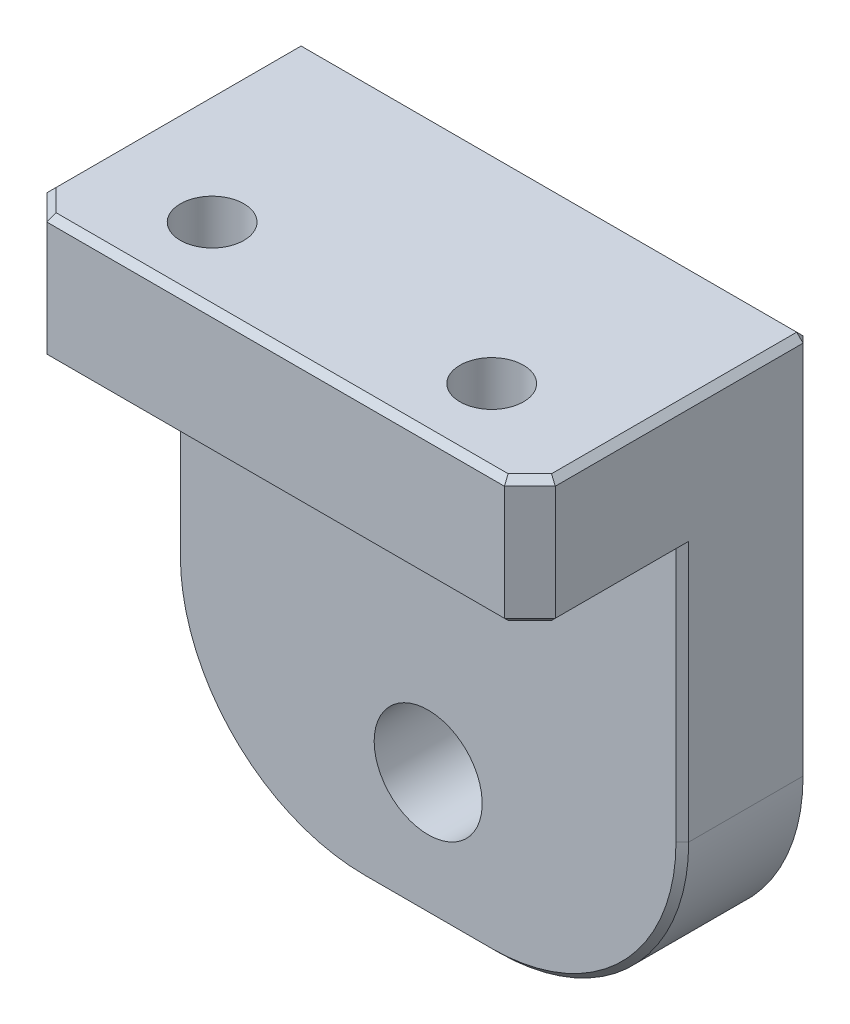
ISO-10303-21;
HEADER;
FILE_DESCRIPTION(('STEP AP214'),'2;1');
FILE_NAME('part.step','',(''),(''),'','','');
FILE_SCHEMA(('AUTOMOTIVE_DESIGN { 1 0 10303 214 1 1 1 1 }'));
ENDSEC;
DATA;
#1=APPLICATION_CONTEXT('core data for automotive mechanical design processes');
#2=APPLICATION_PROTOCOL_DEFINITION('international standard','automotive_design',2000,#1);
#3=PRODUCT_CONTEXT('',#1,'mechanical');
#4=PRODUCT('Part','Part','',(#3));
#5=PRODUCT_RELATED_PRODUCT_CATEGORY('part','',(#4));
#6=PRODUCT_DEFINITION_FORMATION('','',#4);
#7=PRODUCT_DEFINITION_CONTEXT('part definition',#1,'design');
#8=PRODUCT_DEFINITION('design','',#6,#7);
#9=PRODUCT_DEFINITION_SHAPE('','',#8);
#10=(LENGTH_UNIT() NAMED_UNIT(*) SI_UNIT(.MILLI.,.METRE.));
#11=(NAMED_UNIT(*) PLANE_ANGLE_UNIT() SI_UNIT($,.RADIAN.));
#12=(NAMED_UNIT(*) SI_UNIT($,.STERADIAN.) SOLID_ANGLE_UNIT());
#13=UNCERTAINTY_MEASURE_WITH_UNIT(LENGTH_MEASURE(1.E-05),#10,'distance_accuracy_value','');
#14=(GEOMETRIC_REPRESENTATION_CONTEXT(3) GLOBAL_UNCERTAINTY_ASSIGNED_CONTEXT((#13)) GLOBAL_UNIT_ASSIGNED_CONTEXT((#10,
#11,#12)) REPRESENTATION_CONTEXT('',''));
#15=CARTESIAN_POINT('',(0.,0.,0.));
#16=DIRECTION('',(0.,0.,1.));
#17=DIRECTION('',(1.,0.,0.));
#18=AXIS2_PLACEMENT_3D('',#15,#16,#17);
#19=CARTESIAN_POINT('',(0.,0.,5.));
#20=DIRECTION('',(0.,0.,-1.));
#21=DIRECTION('',(-1.,0.,0.));
#22=AXIS2_PLACEMENT_3D('',#19,#20,#21);
#23=PLANE('',#22);
#24=DIRECTION('',(1.,0.,0.));
#25=VECTOR('',#24,1.);
#26=CARTESIAN_POINT('',(-20.,12.5,5.));
#27=LINE('',#26,#25);
#28=CARTESIAN_POINT('',(-19.5,12.5,5.));
#29=VERTEX_POINT('',#28);
#30=CARTESIAN_POINT('',(19.5,12.5,5.));
#31=VERTEX_POINT('',#30);
#32=EDGE_CURVE('E207',#29,#31,#27,.T.);
#33=ORIENTED_EDGE('',*,*,#32,.F.);
#34=DIRECTION('',(0.,-1.,0.));
#35=VECTOR('',#34,1.);
#36=CARTESIAN_POINT('',(-19.5,0.,5.));
#37=LINE('',#36,#35);
#38=CARTESIAN_POINT('',(-19.5,-7.5,5.));
#39=VERTEX_POINT('',#38);
#40=EDGE_CURVE('E194',#29,#39,#37,.T.);
#41=ORIENTED_EDGE('',*,*,#40,.T.);
#42=CARTESIAN_POINT('',(-5.,-7.5,5.));
#43=DIRECTION('',(0.,0.,-1.));
#44=DIRECTION('',(-1.,0.,0.));
#45=AXIS2_PLACEMENT_3D('',#42,#43,#44);
#46=CIRCLE('',#45,14.5);
#47=CARTESIAN_POINT('',(-5.,-22.,5.));
#48=VERTEX_POINT('',#47);
#49=EDGE_CURVE('E202',#39,#48,#46,.F.);
#50=ORIENTED_EDGE('',*,*,#49,.T.);
#51=DIRECTION('',(1.,0.,0.));
#52=VECTOR('',#51,1.);
#53=CARTESIAN_POINT('',(0.,-22.,5.));
#54=LINE('',#53,#52);
#55=CARTESIAN_POINT('',(5.,-22.,5.));
#56=VERTEX_POINT('',#55);
#57=EDGE_CURVE('E285',#48,#56,#54,.T.);
#58=ORIENTED_EDGE('',*,*,#57,.T.);
#59=CARTESIAN_POINT('',(5.,-7.5,5.));
#60=DIRECTION('',(0.,0.,-1.));
#61=DIRECTION('',(-1.,0.,0.));
#62=AXIS2_PLACEMENT_3D('',#59,#60,#61);
#63=CIRCLE('',#62,14.5);
#64=CARTESIAN_POINT('',(19.5,-7.5,5.));
#65=VERTEX_POINT('',#64);
#66=EDGE_CURVE('E282',#56,#65,#63,.F.);
#67=ORIENTED_EDGE('',*,*,#66,.T.);
#68=DIRECTION('',(0.,1.,0.));
#69=VECTOR('',#68,1.);
#70=CARTESIAN_POINT('',(19.5,0.,5.));
#71=LINE('',#70,#69);
#72=EDGE_CURVE('E216',#65,#31,#71,.T.);
#73=ORIENTED_EDGE('',*,*,#72,.T.);
#74=EDGE_LOOP('',(#33,#41,#50,#58,#67,#73));
#75=FACE_BOUND('',#74,.T.);
#76=CARTESIAN_POINT('',(0.,-12.5,5.));
#77=DIRECTION('',(0.,0.,-1.));
#78=DIRECTION('',(-1.,0.,0.));
#79=AXIS2_PLACEMENT_3D('',#76,#77,#78);
#80=CIRCLE('',#79,4.24999999999999);
#81=CARTESIAN_POINT('',(-4.25,-12.5,5.));
#82=VERTEX_POINT('',#81);
#83=EDGE_CURVE('E218',#82,#82,#80,.T.);
#84=ORIENTED_EDGE('',*,*,#83,.T.);
#85=EDGE_LOOP('',(#84));
#86=FACE_BOUND('',#85,.T.);
#87=ADVANCED_FACE('F36',(#75,#86),#23,.F.);
#88=CARTESIAN_POINT('',(20.,-22.5,5.));
#89=DIRECTION('',(-1.,0.,0.));
#90=DIRECTION('',(0.,0.,1.));
#91=AXIS2_PLACEMENT_3D('',#88,#89,#90);
#92=PLANE('',#91);
#93=DIRECTION('',(0.,-1.,0.));
#94=VECTOR('',#93,1.);
#95=CARTESIAN_POINT('',(20.,12.5,15.));
#96=LINE('',#95,#94);
#97=CARTESIAN_POINT('',(20.,22.,15.));
#98=VERTEX_POINT('',#97);
#99=CARTESIAN_POINT('',(20.,13.,15.));
#100=VERTEX_POINT('',#99);
#101=EDGE_CURVE('E245',#98,#100,#96,.T.);
#102=ORIENTED_EDGE('',*,*,#101,.T.);
#103=DIRECTION('',(0.,0.,-1.));
#104=VECTOR('',#103,1.);
#105=CARTESIAN_POINT('',(20.,13.,5.));
#106=LINE('',#105,#104);
#107=CARTESIAN_POINT('',(20.,13.,4.5));
#108=VERTEX_POINT('',#107);
#109=EDGE_CURVE('E280',#100,#108,#106,.T.);
#110=ORIENTED_EDGE('',*,*,#109,.T.);
#111=DIRECTION('',(0.,-1.,0.));
#112=VECTOR('',#111,1.);
#113=CARTESIAN_POINT('',(20.,-22.5,4.5));
#114=LINE('',#113,#112);
#115=CARTESIAN_POINT('',(20.,-7.5,4.5));
#116=VERTEX_POINT('',#115);
#117=EDGE_CURVE('E278',#108,#116,#114,.T.);
#118=ORIENTED_EDGE('',*,*,#117,.T.);
#119=DIRECTION('',(0.,0.,-1.));
#120=VECTOR('',#119,1.);
#121=CARTESIAN_POINT('',(20.,-7.5,5.));
#122=LINE('',#121,#120);
#123=CARTESIAN_POINT('',(20.,-7.5,-4.5));
#124=VERTEX_POINT('',#123);
#125=EDGE_CURVE('E233',#116,#124,#122,.T.);
#126=ORIENTED_EDGE('',*,*,#125,.T.);
#127=DIRECTION('',(0.,1.,0.));
#128=VECTOR('',#127,1.);
#129=CARTESIAN_POINT('',(20.,22.5,-4.5));
#130=LINE('',#129,#128);
#131=CARTESIAN_POINT('',(20.,22.,-4.5));
#132=VERTEX_POINT('',#131);
#133=EDGE_CURVE('E274',#124,#132,#130,.T.);
#134=ORIENTED_EDGE('',*,*,#133,.T.);
#135=DIRECTION('',(0.,0.,1.));
#136=VECTOR('',#135,1.);
#137=CARTESIAN_POINT('',(20.,22.,5.));
#138=LINE('',#137,#136);
#139=EDGE_CURVE('E276',#132,#98,#138,.T.);
#140=ORIENTED_EDGE('',*,*,#139,.T.);
#141=EDGE_LOOP('',(#102,#110,#118,#126,#134,#140));
#142=FACE_BOUND('',#141,.T.);
#143=ADVANCED_FACE('F454',(#142),#92,.F.);
#144=CARTESIAN_POINT('',(-20.,22.5,5.));
#145=DIRECTION('',(0.,-1.,0.));
#146=DIRECTION('',(0.,0.,-1.));
#147=AXIS2_PLACEMENT_3D('',#144,#145,#146);
#148=PLANE('',#147);
#149=DIRECTION('',(0.,0.,1.));
#150=VECTOR('',#149,1.);
#151=CARTESIAN_POINT('',(-19.5,22.5,5.));
#152=LINE('',#151,#150);
#153=CARTESIAN_POINT('',(-19.5,22.5,-4.5));
#154=VERTEX_POINT('',#153);
#155=CARTESIAN_POINT('',(-19.5,22.5,14.7928932188134));
#156=VERTEX_POINT('',#155);
#157=EDGE_CURVE('E316',#154,#156,#152,.T.);
#158=ORIENTED_EDGE('',*,*,#157,.T.);
#159=DIRECTION('',(0.707106781186546,0.,0.707106781186549));
#160=VECTOR('',#159,1.);
#161=CARTESIAN_POINT('',(-17.6464466094067,22.5,16.6464466094067));
#162=LINE('',#161,#160);
#163=CARTESIAN_POINT('',(-17.7928932188134,22.5,16.5));
#164=VERTEX_POINT('',#163);
#165=EDGE_CURVE('E11',#156,#164,#162,.T.);
#166=ORIENTED_EDGE('',*,*,#165,.T.);
#167=DIRECTION('',(1.,0.,0.));
#168=VECTOR('',#167,1.);
#169=CARTESIAN_POINT('',(18.,22.5,16.5));
#170=LINE('',#169,#168);
#171=CARTESIAN_POINT('',(17.7928932188134,22.5,16.5));
#172=VERTEX_POINT('',#171);
#173=EDGE_CURVE('E45',#164,#172,#170,.T.);
#174=ORIENTED_EDGE('',*,*,#173,.T.);
#175=DIRECTION('',(0.707106781186546,0.,-0.707106781186549));
#176=VECTOR('',#175,1.);
#177=CARTESIAN_POINT('',(19.6464466094067,22.5,14.6464466094067));
#178=LINE('',#177,#176);
#179=CARTESIAN_POINT('',(19.5,22.5,14.7928932188134));
#180=VERTEX_POINT('',#179);
#181=EDGE_CURVE('E318',#172,#180,#178,.T.);
#182=ORIENTED_EDGE('',*,*,#181,.T.);
#183=DIRECTION('',(0.,0.,-1.));
#184=VECTOR('',#183,1.);
#185=CARTESIAN_POINT('',(19.5,22.5,5.));
#186=LINE('',#185,#184);
#187=CARTESIAN_POINT('',(19.5,22.5,-4.5));
#188=VERTEX_POINT('',#187);
#189=EDGE_CURVE('E314',#180,#188,#186,.T.);
#190=ORIENTED_EDGE('',*,*,#189,.T.);
#191=DIRECTION('',(-1.,0.,0.));
#192=VECTOR('',#191,1.);
#193=CARTESIAN_POINT('',(-20.,22.5,-4.5));
#194=LINE('',#193,#192);
#195=EDGE_CURVE('E312',#188,#154,#194,.T.);
#196=ORIENTED_EDGE('',*,*,#195,.T.);
#197=EDGE_LOOP('',(#158,#166,#174,#182,#190,#196));
#198=FACE_BOUND('',#197,.T.);
#199=CARTESIAN_POINT('',(11.,22.5,11.));
#200=DIRECTION('',(0.,-1.,0.));
#201=DIRECTION('',(0.,0.,-1.));
#202=AXIS2_PLACEMENT_3D('',#199,#200,#201);
#203=CIRCLE('',#202,2.49999999999999);
#204=CARTESIAN_POINT('',(11.,22.5,8.50000000000001));
#205=VERTEX_POINT('',#204);
#206=EDGE_CURVE('E486',#205,#205,#203,.T.);
#207=ORIENTED_EDGE('',*,*,#206,.T.);
#208=EDGE_LOOP('',(#207));
#209=FACE_BOUND('',#208,.T.);
#210=CARTESIAN_POINT('',(-11.,22.5,11.));
#211=DIRECTION('',(0.,-1.,0.));
#212=DIRECTION('',(0.,0.,-1.));
#213=AXIS2_PLACEMENT_3D('',#210,#211,#212);
#214=CIRCLE('',#213,2.49999999999999);
#215=CARTESIAN_POINT('',(-11.,22.5,8.50000000000001));
#216=VERTEX_POINT('',#215);
#217=EDGE_CURVE('E489',#216,#216,#214,.T.);
#218=ORIENTED_EDGE('',*,*,#217,.T.);
#219=EDGE_LOOP('',(#218));
#220=FACE_BOUND('',#219,.T.);
#221=ADVANCED_FACE('F479',(#198,#209,#220),#148,.F.);
#222=CARTESIAN_POINT('',(-20.,-22.5,5.));
#223=DIRECTION('',(1.,0.,0.));
#224=DIRECTION('',(0.,0.,-1.));
#225=AXIS2_PLACEMENT_3D('',#222,#223,#224);
#226=PLANE('',#225);
#227=DIRECTION('',(0.,1.,0.));
#228=VECTOR('',#227,1.);
#229=CARTESIAN_POINT('',(-20.,-22.5,4.5));
#230=LINE('',#229,#228);
#231=CARTESIAN_POINT('',(-20.,-7.5,4.5));
#232=VERTEX_POINT('',#231);
#233=CARTESIAN_POINT('',(-20.,13.,4.5));
#234=VERTEX_POINT('',#233);
#235=EDGE_CURVE('E259',#232,#234,#230,.T.);
#236=ORIENTED_EDGE('',*,*,#235,.T.);
#237=DIRECTION('',(0.,0.,1.));
#238=VECTOR('',#237,1.);
#239=CARTESIAN_POINT('',(-20.,13.,5.));
#240=LINE('',#239,#238);
#241=CARTESIAN_POINT('',(-20.,13.,15.));
#242=VERTEX_POINT('',#241);
#243=EDGE_CURVE('E188',#234,#242,#240,.T.);
#244=ORIENTED_EDGE('',*,*,#243,.T.);
#245=DIRECTION('',(0.,1.,0.));
#246=VECTOR('',#245,1.);
#247=CARTESIAN_POINT('',(-20.,22.5,15.));
#248=LINE('',#247,#246);
#249=CARTESIAN_POINT('',(-20.,22.,15.));
#250=VERTEX_POINT('',#249);
#251=EDGE_CURVE('E242',#242,#250,#248,.T.);
#252=ORIENTED_EDGE('',*,*,#251,.T.);
#253=DIRECTION('',(0.,0.,-1.));
#254=VECTOR('',#253,1.);
#255=CARTESIAN_POINT('',(-20.,22.,5.));
#256=LINE('',#255,#254);
#257=CARTESIAN_POINT('',(-20.,22.,-4.5));
#258=VERTEX_POINT('',#257);
#259=EDGE_CURVE('E212',#250,#258,#256,.T.);
#260=ORIENTED_EDGE('',*,*,#259,.T.);
#261=DIRECTION('',(0.,-1.,0.));
#262=VECTOR('',#261,1.);
#263=CARTESIAN_POINT('',(-20.,-7.5,-4.5));
#264=LINE('',#263,#262);
#265=CARTESIAN_POINT('',(-20.,-7.5,-4.5));
#266=VERTEX_POINT('',#265);
#267=EDGE_CURVE('E256',#258,#266,#264,.T.);
#268=ORIENTED_EDGE('',*,*,#267,.T.);
#269=DIRECTION('',(0.,0.,-1.));
#270=VECTOR('',#269,1.);
#271=CARTESIAN_POINT('',(-20.,-7.5,5.));
#272=LINE('',#271,#270);
#273=EDGE_CURVE('E230',#266,#232,#272,.F.);
#274=ORIENTED_EDGE('',*,*,#273,.T.);
#275=EDGE_LOOP('',(#236,#244,#252,#260,#268,#274));
#276=FACE_BOUND('',#275,.T.);
#277=ADVANCED_FACE('F411',(#276),#226,.F.);
#278=CARTESIAN_POINT('',(-20.,-22.5,5.));
#279=DIRECTION('',(0.,1.,0.));
#280=DIRECTION('',(0.,0.,1.));
#281=AXIS2_PLACEMENT_3D('',#278,#279,#280);
#282=PLANE('',#281);
#283=DIRECTION('',(0.,0.,-1.));
#284=VECTOR('',#283,1.);
#285=CARTESIAN_POINT('',(5.,-22.5,5.));
#286=LINE('',#285,#284);
#287=CARTESIAN_POINT('',(5.,-22.5,-4.5));
#288=VERTEX_POINT('',#287);
#289=CARTESIAN_POINT('',(5.,-22.5,4.5));
#290=VERTEX_POINT('',#289);
#291=EDGE_CURVE('E217',#288,#290,#286,.F.);
#292=ORIENTED_EDGE('',*,*,#291,.T.);
#293=DIRECTION('',(-1.,0.,0.));
#294=VECTOR('',#293,1.);
#295=CARTESIAN_POINT('',(-20.,-22.5,4.5));
#296=LINE('',#295,#294);
#297=CARTESIAN_POINT('',(-5.,-22.5,4.5));
#298=VERTEX_POINT('',#297);
#299=EDGE_CURVE('E293',#290,#298,#296,.T.);
#300=ORIENTED_EDGE('',*,*,#299,.T.);
#301=DIRECTION('',(0.,0.,-1.));
#302=VECTOR('',#301,1.);
#303=CARTESIAN_POINT('',(-5.,-22.5,5.));
#304=LINE('',#303,#302);
#305=CARTESIAN_POINT('',(-5.,-22.5,-4.5));
#306=VERTEX_POINT('',#305);
#307=EDGE_CURVE('E221',#298,#306,#304,.T.);
#308=ORIENTED_EDGE('',*,*,#307,.T.);
#309=DIRECTION('',(1.,0.,0.));
#310=VECTOR('',#309,1.);
#311=CARTESIAN_POINT('',(5.,-22.5,-4.5));
#312=LINE('',#311,#310);
#313=EDGE_CURVE('E291',#306,#288,#312,.T.);
#314=ORIENTED_EDGE('',*,*,#313,.T.);
#315=EDGE_LOOP('',(#292,#300,#308,#314));
#316=FACE_BOUND('',#315,.T.);
#317=ADVANCED_FACE('F530',(#316),#282,.F.);
#318=CARTESIAN_POINT('',(0.,0.,-5.));
#319=DIRECTION('',(0.,0.,-1.));
#320=DIRECTION('',(-1.,0.,0.));
#321=AXIS2_PLACEMENT_3D('',#318,#319,#320);
#322=PLANE('',#321);
#323=CARTESIAN_POINT('',(-5.,-7.5,-5.));
#324=DIRECTION('',(0.,0.,-1.));
#325=DIRECTION('',(-1.,0.,0.));
#326=AXIS2_PLACEMENT_3D('',#323,#324,#325);
#327=CIRCLE('',#326,14.5);
#328=CARTESIAN_POINT('',(-5.,-22.,-5.));
#329=VERTEX_POINT('',#328);
#330=CARTESIAN_POINT('',(-19.5,-7.5,-5.));
#331=VERTEX_POINT('',#330);
#332=EDGE_CURVE('E307',#329,#331,#327,.T.);
#333=ORIENTED_EDGE('',*,*,#332,.T.);
#334=DIRECTION('',(0.,1.,0.));
#335=VECTOR('',#334,1.);
#336=CARTESIAN_POINT('',(-19.5,22.5,-5.));
#337=LINE('',#336,#335);
#338=CARTESIAN_POINT('',(-19.5,22.,-5.));
#339=VERTEX_POINT('',#338);
#340=EDGE_CURVE('E309',#331,#339,#337,.T.);
#341=ORIENTED_EDGE('',*,*,#340,.T.);
#342=DIRECTION('',(1.,0.,0.));
#343=VECTOR('',#342,1.);
#344=CARTESIAN_POINT('',(20.,22.,-5.));
#345=LINE('',#344,#343);
#346=CARTESIAN_POINT('',(19.5,22.,-5.));
#347=VERTEX_POINT('',#346);
#348=EDGE_CURVE('E299',#339,#347,#345,.T.);
#349=ORIENTED_EDGE('',*,*,#348,.T.);
#350=DIRECTION('',(0.,-1.,0.));
#351=VECTOR('',#350,1.);
#352=CARTESIAN_POINT('',(19.5,-7.5,-5.));
#353=LINE('',#352,#351);
#354=CARTESIAN_POINT('',(19.5,-7.5,-5.));
#355=VERTEX_POINT('',#354);
#356=EDGE_CURVE('E301',#347,#355,#353,.T.);
#357=ORIENTED_EDGE('',*,*,#356,.T.);
#358=CARTESIAN_POINT('',(5.,-7.5,-5.));
#359=DIRECTION('',(0.,0.,-1.));
#360=DIRECTION('',(-1.,0.,0.));
#361=AXIS2_PLACEMENT_3D('',#358,#359,#360);
#362=CIRCLE('',#361,14.5);
#363=CARTESIAN_POINT('',(5.,-22.,-5.));
#364=VERTEX_POINT('',#363);
#365=EDGE_CURVE('E303',#355,#364,#362,.T.);
#366=ORIENTED_EDGE('',*,*,#365,.T.);
#367=DIRECTION('',(-1.,0.,0.));
#368=VECTOR('',#367,1.);
#369=CARTESIAN_POINT('',(-5.,-22.,-5.));
#370=LINE('',#369,#368);
#371=EDGE_CURVE('E305',#364,#329,#370,.T.);
#372=ORIENTED_EDGE('',*,*,#371,.T.);
#373=EDGE_LOOP('',(#333,#341,#349,#357,#366,#372));
#374=FACE_BOUND('',#373,.T.);
#375=CARTESIAN_POINT('',(0.,-12.5,-5.));
#376=DIRECTION('',(0.,0.,-1.));
#377=DIRECTION('',(-1.,0.,0.));
#378=AXIS2_PLACEMENT_3D('',#375,#376,#377);
#379=CIRCLE('',#378,4.25);
#380=CARTESIAN_POINT('',(-4.25,-12.5,-5.));
#381=VERTEX_POINT('',#380);
#382=EDGE_CURVE('E224',#381,#381,#379,.T.);
#383=ORIENTED_EDGE('',*,*,#382,.F.);
#384=EDGE_LOOP('',(#383));
#385=FACE_BOUND('',#384,.T.);
#386=ADVANCED_FACE('F468',(#374,#385),#322,.T.);
#387=CARTESIAN_POINT('',(-20.,12.5,17.));
#388=DIRECTION('',(0.,1.,0.));
#389=DIRECTION('',(-1.,0.,0.));
#390=AXIS2_PLACEMENT_3D('',#387,#388,#389);
#391=PLANE('',#390);
#392=CARTESIAN_POINT('',(11.,12.5,11.));
#393=DIRECTION('',(0.,-1.,0.));
#394=DIRECTION('',(0.,0.,-1.));
#395=AXIS2_PLACEMENT_3D('',#392,#393,#394);
#396=CIRCLE('',#395,2.5);
#397=CARTESIAN_POINT('',(11.,12.5,8.50000000000001));
#398=VERTEX_POINT('',#397);
#399=EDGE_CURVE('E344',#398,#398,#396,.T.);
#400=ORIENTED_EDGE('',*,*,#399,.F.);
#401=EDGE_LOOP('',(#400));
#402=FACE_BOUND('',#401,.T.);
#403=CARTESIAN_POINT('',(-11.,12.5,11.));
#404=DIRECTION('',(0.,-1.,0.));
#405=DIRECTION('',(0.,0.,-1.));
#406=AXIS2_PLACEMENT_3D('',#403,#404,#405);
#407=CIRCLE('',#406,2.5);
#408=CARTESIAN_POINT('',(-11.,12.5,8.50000000000001));
#409=VERTEX_POINT('',#408);
#410=EDGE_CURVE('E491',#409,#409,#407,.T.);
#411=ORIENTED_EDGE('',*,*,#410,.F.);
#412=EDGE_LOOP('',(#411));
#413=FACE_BOUND('',#412,.T.);
#414=DIRECTION('',(-0.707106781186546,0.,-0.707106781186549));
#415=VECTOR('',#414,1.);
#416=CARTESIAN_POINT('',(-19.6464466094067,12.5,14.6464466094067));
#417=LINE('',#416,#415);
#418=CARTESIAN_POINT('',(-17.7928932188134,12.5,16.5));
#419=VERTEX_POINT('',#418);
#420=CARTESIAN_POINT('',(-19.5,12.5,14.7928932188134));
#421=VERTEX_POINT('',#420);
#422=EDGE_CURVE('E210',#419,#421,#417,.T.);
#423=ORIENTED_EDGE('',*,*,#422,.T.);
#424=DIRECTION('',(0.,0.,-1.));
#425=VECTOR('',#424,1.);
#426=CARTESIAN_POINT('',(-19.5,12.5,17.));
#427=LINE('',#426,#425);
#428=EDGE_CURVE('E186',#421,#29,#427,.T.);
#429=ORIENTED_EDGE('',*,*,#428,.T.);
#430=ORIENTED_EDGE('',*,*,#32,.T.);
#431=DIRECTION('',(0.,0.,1.));
#432=VECTOR('',#431,1.);
#433=CARTESIAN_POINT('',(19.5,12.5,17.));
#434=LINE('',#433,#432);
#435=CARTESIAN_POINT('',(19.5,12.5,14.7928932188134));
#436=VERTEX_POINT('',#435);
#437=EDGE_CURVE('E248',#31,#436,#434,.T.);
#438=ORIENTED_EDGE('',*,*,#437,.T.);
#439=DIRECTION('',(-0.707106781186546,0.,0.707106781186549));
#440=VECTOR('',#439,1.);
#441=CARTESIAN_POINT('',(17.6464466094067,12.5,16.6464466094067));
#442=LINE('',#441,#440);
#443=CARTESIAN_POINT('',(17.7928932188134,12.5,16.5));
#444=VERTEX_POINT('',#443);
#445=EDGE_CURVE('E250',#436,#444,#442,.T.);
#446=ORIENTED_EDGE('',*,*,#445,.T.);
#447=DIRECTION('',(-1.,0.,0.));
#448=VECTOR('',#447,1.);
#449=CARTESIAN_POINT('',(-18.,12.5,16.5));
#450=LINE('',#449,#448);
#451=EDGE_CURVE('E252',#444,#419,#450,.T.);
#452=ORIENTED_EDGE('',*,*,#451,.T.);
#453=EDGE_LOOP('',(#423,#429,#430,#438,#446,#452));
#454=FACE_BOUND('',#453,.T.);
#455=ADVANCED_FACE('F206',(#402,#413,#454),#391,.F.);
#456=CARTESIAN_POINT('',(0.,0.,17.));
#457=DIRECTION('',(0.,0.,1.));
#458=DIRECTION('',(1.,0.,0.));
#459=AXIS2_PLACEMENT_3D('',#456,#457,#458);
#460=PLANE('',#459);
#461=DIRECTION('',(0.,-1.,0.));
#462=VECTOR('',#461,1.);
#463=CARTESIAN_POINT('',(-18.,12.5,17.));
#464=LINE('',#463,#462);
#465=CARTESIAN_POINT('',(-18.,22.,17.));
#466=VERTEX_POINT('',#465);
#467=CARTESIAN_POINT('',(-18.,13.,17.));
#468=VERTEX_POINT('',#467);
#469=EDGE_CURVE('E239',#466,#468,#464,.T.);
#470=ORIENTED_EDGE('',*,*,#469,.T.);
#471=DIRECTION('',(1.,0.,0.));
#472=VECTOR('',#471,1.);
#473=CARTESIAN_POINT('',(18.,13.,17.));
#474=LINE('',#473,#472);
#475=CARTESIAN_POINT('',(18.,13.,17.));
#476=VERTEX_POINT('',#475);
#477=EDGE_CURVE('E268',#468,#476,#474,.T.);
#478=ORIENTED_EDGE('',*,*,#477,.T.);
#479=DIRECTION('',(0.,1.,0.));
#480=VECTOR('',#479,1.);
#481=CARTESIAN_POINT('',(18.,22.5,17.));
#482=LINE('',#481,#480);
#483=CARTESIAN_POINT('',(18.,22.,17.));
#484=VERTEX_POINT('',#483);
#485=EDGE_CURVE('E236',#476,#484,#482,.T.);
#486=ORIENTED_EDGE('',*,*,#485,.T.);
#487=DIRECTION('',(-1.,0.,0.));
#488=VECTOR('',#487,1.);
#489=CARTESIAN_POINT('',(-18.,22.,17.));
#490=LINE('',#489,#488);
#491=EDGE_CURVE('E266',#484,#466,#490,.T.);
#492=ORIENTED_EDGE('',*,*,#491,.T.);
#493=EDGE_LOOP('',(#470,#478,#486,#492));
#494=FACE_BOUND('',#493,.T.);
#495=ADVANCED_FACE('F397',(#494),#460,.T.);
#496=CARTESIAN_POINT('',(0.,-12.5,-5.));
#497=DIRECTION('',(0.,0.,-1.));
#498=DIRECTION('',(-1.,0.,0.));
#499=AXIS2_PLACEMENT_3D('',#496,#497,#498);
#500=CYLINDRICAL_SURFACE('',#499,4.24999999999999);
#501=ORIENTED_EDGE('',*,*,#382,.T.);
#502=EDGE_LOOP('',(#501));
#503=FACE_BOUND('',#502,.T.);
#504=ORIENTED_EDGE('',*,*,#83,.F.);
#505=EDGE_LOOP('',(#504));
#506=FACE_BOUND('',#505,.T.);
#507=ADVANCED_FACE('F510',(#503,#506),#500,.F.);
#508=CARTESIAN_POINT('',(-11.,12.5,11.));
#509=DIRECTION('',(0.,-1.,0.));
#510=DIRECTION('',(0.,0.,-1.));
#511=AXIS2_PLACEMENT_3D('',#508,#509,#510);
#512=CYLINDRICAL_SURFACE('',#511,2.49999999999999);
#513=ORIENTED_EDGE('',*,*,#217,.F.);
#514=EDGE_LOOP('',(#513));
#515=FACE_BOUND('',#514,.T.);
#516=ORIENTED_EDGE('',*,*,#410,.T.);
#517=EDGE_LOOP('',(#516));
#518=FACE_BOUND('',#517,.T.);
#519=ADVANCED_FACE('F508',(#515,#518),#512,.F.);
#520=CARTESIAN_POINT('',(11.,12.5,11.));
#521=DIRECTION('',(0.,-1.,0.));
#522=DIRECTION('',(0.,0.,-1.));
#523=AXIS2_PLACEMENT_3D('',#520,#521,#522);
#524=CYLINDRICAL_SURFACE('',#523,2.49999999999999);
#525=ORIENTED_EDGE('',*,*,#206,.F.);
#526=EDGE_LOOP('',(#525));
#527=FACE_BOUND('',#526,.T.);
#528=ORIENTED_EDGE('',*,*,#399,.T.);
#529=EDGE_LOOP('',(#528));
#530=FACE_BOUND('',#529,.T.);
#531=ADVANCED_FACE('F501',(#527,#530),#524,.F.);
#532=CARTESIAN_POINT('',(-5.,-7.5,5.));
#533=DIRECTION('',(0.,0.,-1.));
#534=DIRECTION('',(-1.,0.,0.));
#535=AXIS2_PLACEMENT_3D('',#532,#533,#534);
#536=CYLINDRICAL_SURFACE('',#535,15.);
#537=ORIENTED_EDGE('',*,*,#307,.F.);
#538=CARTESIAN_POINT('',(-5.,-7.5,4.5));
#539=DIRECTION('',(0.,0.,-1.));
#540=DIRECTION('',(-1.,0.,0.));
#541=AXIS2_PLACEMENT_3D('',#538,#539,#540);
#542=CIRCLE('',#541,15.);
#543=EDGE_CURVE('E289',#298,#232,#542,.T.);
#544=ORIENTED_EDGE('',*,*,#543,.T.);
#545=ORIENTED_EDGE('',*,*,#273,.F.);
#546=CARTESIAN_POINT('',(-5.,-7.5,-4.5));
#547=DIRECTION('',(0.,0.,-1.));
#548=DIRECTION('',(-1.,0.,0.));
#549=AXIS2_PLACEMENT_3D('',#546,#547,#548);
#550=CIRCLE('',#549,15.);
#551=EDGE_CURVE('E201',#266,#306,#550,.F.);
#552=ORIENTED_EDGE('',*,*,#551,.T.);
#553=EDGE_LOOP('',(#537,#544,#545,#552));
#554=FACE_BOUND('',#553,.T.);
#555=ADVANCED_FACE('F426',(#554),#536,.T.);
#556=CARTESIAN_POINT('',(5.,-7.5,5.));
#557=DIRECTION('',(0.,0.,-1.));
#558=DIRECTION('',(-1.,0.,0.));
#559=AXIS2_PLACEMENT_3D('',#556,#557,#558);
#560=CYLINDRICAL_SURFACE('',#559,15.);
#561=ORIENTED_EDGE('',*,*,#125,.F.);
#562=CARTESIAN_POINT('',(5.,-7.5,4.5));
#563=DIRECTION('',(0.,0.,-1.));
#564=DIRECTION('',(-1.,0.,0.));
#565=AXIS2_PLACEMENT_3D('',#562,#563,#564);
#566=CIRCLE('',#565,15.);
#567=EDGE_CURVE('E297',#116,#290,#566,.T.);
#568=ORIENTED_EDGE('',*,*,#567,.T.);
#569=ORIENTED_EDGE('',*,*,#291,.F.);
#570=CARTESIAN_POINT('',(5.,-7.5,-4.5));
#571=DIRECTION('',(0.,0.,-1.));
#572=DIRECTION('',(-1.,0.,0.));
#573=AXIS2_PLACEMENT_3D('',#570,#571,#572);
#574=CIRCLE('',#573,15.);
#575=EDGE_CURVE('E295',#288,#124,#574,.F.);
#576=ORIENTED_EDGE('',*,*,#575,.T.);
#577=EDGE_LOOP('',(#561,#568,#569,#576));
#578=FACE_BOUND('',#577,.T.);
#579=ADVANCED_FACE('F538',(#578),#560,.T.);
#580=CARTESIAN_POINT('',(-18.,0.,17.));
#581=DIRECTION('',(-0.707106781186549,0.,0.707106781186546));
#582=DIRECTION('',(0.,1.,0.));
#583=AXIS2_PLACEMENT_3D('',#580,#581,#582);
#584=PLANE('',#583);
#585=ORIENTED_EDGE('',*,*,#251,.F.);
#586=DIRECTION('',(0.707106781186546,0.,0.707106781186549));
#587=VECTOR('',#586,1.);
#588=CARTESIAN_POINT('',(-18.,13.,17.));
#589=LINE('',#588,#587);
#590=EDGE_CURVE('E264',#242,#468,#589,.T.);
#591=ORIENTED_EDGE('',*,*,#590,.T.);
#592=ORIENTED_EDGE('',*,*,#469,.F.);
#593=DIRECTION('',(-0.707106781186546,0.,-0.707106781186549));
#594=VECTOR('',#593,1.);
#595=CARTESIAN_POINT('',(-20.,22.,15.));
#596=LINE('',#595,#594);
#597=EDGE_CURVE('E262',#466,#250,#596,.T.);
#598=ORIENTED_EDGE('',*,*,#597,.T.);
#599=EDGE_LOOP('',(#585,#591,#592,#598));
#600=FACE_BOUND('',#599,.T.);
#601=ADVANCED_FACE('F413',(#600),#584,.T.);
#602=CARTESIAN_POINT('',(18.,0.,17.));
#603=DIRECTION('',(0.707106781186549,0.,0.707106781186546));
#604=DIRECTION('',(0.,-1.,0.));
#605=AXIS2_PLACEMENT_3D('',#602,#603,#604);
#606=PLANE('',#605);
#607=ORIENTED_EDGE('',*,*,#485,.F.);
#608=DIRECTION('',(0.707106781186546,0.,-0.707106781186549));
#609=VECTOR('',#608,1.);
#610=CARTESIAN_POINT('',(20.,13.,15.));
#611=LINE('',#610,#609);
#612=EDGE_CURVE('E272',#476,#100,#611,.T.);
#613=ORIENTED_EDGE('',*,*,#612,.T.);
#614=ORIENTED_EDGE('',*,*,#101,.F.);
#615=DIRECTION('',(-0.707106781186546,0.,0.707106781186549));
#616=VECTOR('',#615,1.);
#617=CARTESIAN_POINT('',(18.,22.,17.));
#618=LINE('',#617,#616);
#619=EDGE_CURVE('E270',#98,#484,#618,.T.);
#620=ORIENTED_EDGE('',*,*,#619,.T.);
#621=EDGE_LOOP('',(#607,#613,#614,#620));
#622=FACE_BOUND('',#621,.T.);
#623=ADVANCED_FACE('F394',(#622),#606,.T.);
#624=CARTESIAN_POINT('',(19.5,0.,5.));
#625=DIRECTION('',(-0.707106781186547,0.,-0.707106781186547));
#626=DIRECTION('',(0.,1.,0.));
#627=AXIS2_PLACEMENT_3D('',#624,#625,#626);
#628=PLANE('',#627);
#629=DIRECTION('',(-0.707106781186547,0.,0.707106781186547));
#630=VECTOR('',#629,1.);
#631=CARTESIAN_POINT('',(20.,-7.5,4.5));
#632=LINE('',#631,#630);
#633=EDGE_CURVE('E338',#116,#65,#632,.T.);
#634=ORIENTED_EDGE('',*,*,#633,.F.);
#635=ORIENTED_EDGE('',*,*,#117,.F.);
#636=DIRECTION('',(-0.577350269189624,-0.57735026918963,0.577350269189624));
#637=VECTOR('',#636,1.);
#638=CARTESIAN_POINT('',(19.8333333333333,12.8333333333333,4.66666666666667));
#639=LINE('',#638,#637);
#640=EDGE_CURVE('E341',#31,#108,#639,.F.);
#641=ORIENTED_EDGE('',*,*,#640,.F.);
#642=ORIENTED_EDGE('',*,*,#72,.F.);
#643=EDGE_LOOP('',(#634,#635,#641,#642));
#644=FACE_BOUND('',#643,.T.);
#645=ADVANCED_FACE('F443',(#644),#628,.F.);
#646=CARTESIAN_POINT('',(20.,13.,5.));
#647=DIRECTION('',(-0.707106781186551,0.707106781186544,0.));
#648=DIRECTION('',(0.,0.,-1.));
#649=AXIS2_PLACEMENT_3D('',#646,#647,#648);
#650=PLANE('',#649);
#651=ORIENTED_EDGE('',*,*,#640,.T.);
#652=ORIENTED_EDGE('',*,*,#109,.F.);
#653=DIRECTION('',(0.67859834454584,0.678598344545847,0.281084637714838));
#654=VECTOR('',#653,1.);
#655=CARTESIAN_POINT('',(18.0925643016944,11.0925643016944,14.2099142644072));
#656=LINE('',#655,#654);
#657=EDGE_CURVE('E335',#436,#100,#656,.T.);
#658=ORIENTED_EDGE('',*,*,#657,.F.);
#659=ORIENTED_EDGE('',*,*,#437,.F.);
#660=EDGE_LOOP('',(#651,#652,#658,#659));
#661=FACE_BOUND('',#660,.T.);
#662=ADVANCED_FACE('F449',(#661),#650,.F.);
#663=CARTESIAN_POINT('',(5.,-7.5,5.));
#664=DIRECTION('',(0.,0.,-1.));
#665=DIRECTION('',(-1.,0.,0.));
#666=AXIS2_PLACEMENT_3D('',#663,#664,#665);
#667=CONICAL_SURFACE('',#666,14.5,0.785398163397448);
#668=ORIENTED_EDGE('',*,*,#633,.T.);
#669=ORIENTED_EDGE('',*,*,#66,.F.);
#670=DIRECTION('',(0.,0.707106781186547,0.707106781186547));
#671=VECTOR('',#670,1.);
#672=CARTESIAN_POINT('',(5.,-22.5,4.5));
#673=LINE('',#672,#671);
#674=EDGE_CURVE('E332',#290,#56,#673,.T.);
#675=ORIENTED_EDGE('',*,*,#674,.F.);
#676=ORIENTED_EDGE('',*,*,#567,.F.);
#677=EDGE_LOOP('',(#668,#669,#675,#676));
#678=FACE_BOUND('',#677,.T.);
#679=ADVANCED_FACE('F440',(#678),#667,.T.);
#680=CARTESIAN_POINT('',(-1.35355339059321,12.5,35.6464466094067));
#681=DIRECTION('',(0.499999999999998,-0.707106781186552,0.499999999999996));
#682=DIRECTION('',(0.707106781186546,0.,-0.707106781186549));
#683=AXIS2_PLACEMENT_3D('',#680,#681,#682);
#684=PLANE('',#683);
#685=ORIENTED_EDGE('',*,*,#657,.T.);
#686=ORIENTED_EDGE('',*,*,#612,.F.);
#687=DIRECTION('',(-0.281084637714833,-0.678598344545845,-0.678598344545844));
#688=VECTOR('',#687,1.);
#689=CARTESIAN_POINT('',(19.9322213593237,17.664795011186,21.664795011186));
#690=LINE('',#689,#688);
#691=EDGE_CURVE('E329',#444,#476,#690,.F.);
#692=ORIENTED_EDGE('',*,*,#691,.F.);
#693=ORIENTED_EDGE('',*,*,#445,.F.);
#694=EDGE_LOOP('',(#685,#686,#692,#693));
#695=FACE_BOUND('',#694,.T.);
#696=ADVANCED_FACE('F452',(#695),#684,.T.);
#697=CARTESIAN_POINT('',(0.,-22.,5.));
#698=DIRECTION('',(0.,0.707106781186547,-0.707106781186547));
#699=DIRECTION('',(1.,0.,0.));
#700=AXIS2_PLACEMENT_3D('',#697,#698,#699);
#701=PLANE('',#700);
#702=ORIENTED_EDGE('',*,*,#674,.T.);
#703=ORIENTED_EDGE('',*,*,#57,.F.);
#704=DIRECTION('',(0.,0.707106781186547,0.707106781186547));
#705=VECTOR('',#704,1.);
#706=CARTESIAN_POINT('',(-5.,-22.5,4.5));
#707=LINE('',#706,#705);
#708=EDGE_CURVE('E326',#298,#48,#707,.T.);
#709=ORIENTED_EDGE('',*,*,#708,.F.);
#710=ORIENTED_EDGE('',*,*,#299,.F.);
#711=EDGE_LOOP('',(#702,#703,#709,#710));
#712=FACE_BOUND('',#711,.T.);
#713=ADVANCED_FACE('F435',(#712),#701,.F.);
#714=CARTESIAN_POINT('',(0.,13.,17.));
#715=DIRECTION('',(0.,-0.707106781186547,0.707106781186548));
#716=DIRECTION('',(-1.,0.,0.));
#717=AXIS2_PLACEMENT_3D('',#714,#715,#716);
#718=PLANE('',#717);
#719=ORIENTED_EDGE('',*,*,#691,.T.);
#720=ORIENTED_EDGE('',*,*,#477,.F.);
#721=DIRECTION('',(0.281084637714823,-0.678598344545847,-0.678598344545846));
#722=VECTOR('',#721,1.);
#723=CARTESIAN_POINT('',(-16.5778456759331,9.56661574305015,13.5666157430501));
#724=LINE('',#723,#722);
#725=EDGE_CURVE('E323',#419,#468,#724,.F.);
#726=ORIENTED_EDGE('',*,*,#725,.F.);
#727=ORIENTED_EDGE('',*,*,#451,.F.);
#728=EDGE_LOOP('',(#719,#720,#726,#727));
#729=FACE_BOUND('',#728,.T.);
#730=ADVANCED_FACE('F402',(#729),#718,.T.);
#731=CARTESIAN_POINT('',(-5.,-7.5,5.));
#732=DIRECTION('',(0.,0.,-1.));
#733=DIRECTION('',(-1.,0.,0.));
#734=AXIS2_PLACEMENT_3D('',#731,#732,#733);
#735=CONICAL_SURFACE('',#734,14.5,0.785398163397448);
#736=ORIENTED_EDGE('',*,*,#708,.T.);
#737=ORIENTED_EDGE('',*,*,#49,.F.);
#738=DIRECTION('',(0.707106781186547,0.,0.707106781186547));
#739=VECTOR('',#738,1.);
#740=CARTESIAN_POINT('',(-20.,-7.5,4.5));
#741=LINE('',#740,#739);
#742=EDGE_CURVE('E197',#232,#39,#741,.T.);
#743=ORIENTED_EDGE('',*,*,#742,.F.);
#744=ORIENTED_EDGE('',*,*,#543,.F.);
#745=EDGE_LOOP('',(#736,#737,#743,#744));
#746=FACE_BOUND('',#745,.T.);
#747=ADVANCED_FACE('F431',(#746),#735,.T.);
#748=CARTESIAN_POINT('',(-18.6464466094067,12.5,15.6464466094067));
#749=DIRECTION('',(-0.500000000000001,-0.707106781186548,0.499999999999999));
#750=DIRECTION('',(0.707106781186546,0.,0.707106781186549));
#751=AXIS2_PLACEMENT_3D('',#748,#749,#750);
#752=PLANE('',#751);
#753=ORIENTED_EDGE('',*,*,#725,.T.);
#754=ORIENTED_EDGE('',*,*,#590,.F.);
#755=DIRECTION('',(-0.678598344545844,0.678598344545848,0.281084637714825));
#756=VECTOR('',#755,1.);
#757=CARTESIAN_POINT('',(-19.2697521433898,12.2697521433898,14.6975214338982));
#758=LINE('',#757,#756);
#759=EDGE_CURVE('E191',#421,#242,#758,.T.);
#760=ORIENTED_EDGE('',*,*,#759,.F.);
#761=ORIENTED_EDGE('',*,*,#422,.F.);
#762=EDGE_LOOP('',(#753,#754,#760,#761));
#763=FACE_BOUND('',#762,.T.);
#764=ADVANCED_FACE('F407',(#763),#752,.T.);
#765=CARTESIAN_POINT('',(-19.5,0.,5.));
#766=DIRECTION('',(0.707106781186547,0.,-0.707106781186547));
#767=DIRECTION('',(0.,-1.,0.));
#768=AXIS2_PLACEMENT_3D('',#765,#766,#767);
#769=PLANE('',#768);
#770=ORIENTED_EDGE('',*,*,#742,.T.);
#771=ORIENTED_EDGE('',*,*,#40,.F.);
#772=DIRECTION('',(-0.577350269189625,0.577350269189628,-0.577350269189625));
#773=VECTOR('',#772,1.);
#774=CARTESIAN_POINT('',(-15.5,8.49999999999999,8.99999999999998));
#775=LINE('',#774,#773);
#776=EDGE_CURVE('E182',#234,#29,#775,.F.);
#777=ORIENTED_EDGE('',*,*,#776,.F.);
#778=ORIENTED_EDGE('',*,*,#235,.F.);
#779=EDGE_LOOP('',(#770,#771,#777,#778));
#780=FACE_BOUND('',#779,.T.);
#781=ADVANCED_FACE('F195',(#780),#769,.F.);
#782=CARTESIAN_POINT('',(-19.5,12.5,17.));
#783=DIRECTION('',(0.70710678118655,0.707106781186545,0.));
#784=DIRECTION('',(0.,0.,-1.));
#785=AXIS2_PLACEMENT_3D('',#782,#783,#784);
#786=PLANE('',#785);
#787=ORIENTED_EDGE('',*,*,#759,.T.);
#788=ORIENTED_EDGE('',*,*,#243,.F.);
#789=ORIENTED_EDGE('',*,*,#776,.T.);
#790=ORIENTED_EDGE('',*,*,#428,.F.);
#791=EDGE_LOOP('',(#787,#788,#789,#790));
#792=FACE_BOUND('',#791,.T.);
#793=ADVANCED_FACE('F184',(#792),#786,.F.);
#794=CARTESIAN_POINT('',(4.64644660940678,22.5,29.6464466094067));
#795=DIRECTION('',(0.499999999999999,0.70710678118655,0.499999999999997));
#796=DIRECTION('',(-0.707106781186546,0.,0.707106781186549));
#797=AXIS2_PLACEMENT_3D('',#794,#795,#796);
#798=PLANE('',#797);
#799=DIRECTION('',(0.281084637714827,-0.678598344545846,0.678598344545846));
#800=VECTOR('',#799,1.);
#801=CARTESIAN_POINT('',(19.261811381696,18.9537178491528,20.0462821508472));
#802=LINE('',#801,#800);
#803=EDGE_CURVE('E376',#484,#172,#802,.F.);
#804=ORIENTED_EDGE('',*,*,#803,.F.);
#805=ORIENTED_EDGE('',*,*,#619,.F.);
#806=DIRECTION('',(-0.678598344545846,0.678598344545846,-0.281084637714826));
#807=VECTOR('',#806,1.);
#808=CARTESIAN_POINT('',(17.6320685884741,24.3679314115259,14.0191706945767));
#809=LINE('',#808,#807);
#810=EDGE_CURVE('E40',#180,#98,#809,.F.);
#811=ORIENTED_EDGE('',*,*,#810,.F.);
#812=ORIENTED_EDGE('',*,*,#181,.F.);
#813=EDGE_LOOP('',(#804,#805,#811,#812));
#814=FACE_BOUND('',#813,.T.);
#815=ADVANCED_FACE('F38',(#814),#798,.T.);
#816=CARTESIAN_POINT('',(19.5,22.5,5.));
#817=DIRECTION('',(-0.707106781186547,-0.707106781186547,0.));
#818=DIRECTION('',(0.,0.,-1.));
#819=AXIS2_PLACEMENT_3D('',#816,#817,#818);
#820=PLANE('',#819);
#821=ORIENTED_EDGE('',*,*,#810,.T.);
#822=ORIENTED_EDGE('',*,*,#139,.F.);
#823=DIRECTION('',(-0.707106781186547,0.707106781186547,0.));
#824=VECTOR('',#823,1.);
#825=CARTESIAN_POINT('',(19.5,22.5,-4.5));
#826=LINE('',#825,#824);
#827=EDGE_CURVE('E371',#188,#132,#826,.F.);
#828=ORIENTED_EDGE('',*,*,#827,.F.);
#829=ORIENTED_EDGE('',*,*,#189,.F.);
#830=EDGE_LOOP('',(#821,#822,#828,#829));
#831=FACE_BOUND('',#830,.T.);
#832=ADVANCED_FACE('F386',(#831),#820,.F.);
#833=CARTESIAN_POINT('',(0.,22.,17.));
#834=DIRECTION('',(0.,0.707106781186547,0.707106781186547));
#835=DIRECTION('',(1.,0.,0.));
#836=AXIS2_PLACEMENT_3D('',#833,#834,#835);
#837=PLANE('',#836);
#838=ORIENTED_EDGE('',*,*,#803,.T.);
#839=ORIENTED_EDGE('',*,*,#173,.F.);
#840=DIRECTION('',(-0.281084637714821,-0.678598344545847,0.678598344545847));
#841=VECTOR('',#840,1.);
#842=CARTESIAN_POINT('',(-16.5778456759331,25.4333842569498,13.5666157430502));
#843=LINE('',#842,#841);
#844=EDGE_CURVE('E53',#466,#164,#843,.F.);
#845=ORIENTED_EDGE('',*,*,#844,.F.);
#846=ORIENTED_EDGE('',*,*,#491,.F.);
#847=EDGE_LOOP('',(#838,#839,#845,#846));
#848=FACE_BOUND('',#847,.T.);
#849=ADVANCED_FACE('F593',(#848),#837,.T.);
#850=CARTESIAN_POINT('',(20.,-22.5,-4.5));
#851=DIRECTION('',(0.707106781186547,0.,-0.707106781186547));
#852=DIRECTION('',(0.,-1.,0.));
#853=AXIS2_PLACEMENT_3D('',#850,#851,#852);
#854=PLANE('',#853);
#855=DIRECTION('',(-0.707106781186547,0.,-0.707106781186547));
#856=VECTOR('',#855,1.);
#857=CARTESIAN_POINT('',(19.75,22.,-4.75));
#858=LINE('',#857,#856);
#859=EDGE_CURVE('E374',#132,#347,#858,.T.);
#860=ORIENTED_EDGE('',*,*,#859,.F.);
#861=ORIENTED_EDGE('',*,*,#133,.F.);
#862=DIRECTION('',(0.707106781186547,0.,0.707106781186547));
#863=VECTOR('',#862,1.);
#864=CARTESIAN_POINT('',(19.5,-7.5,-5.));
#865=LINE('',#864,#863);
#866=EDGE_CURVE('E367',#355,#124,#865,.T.);
#867=ORIENTED_EDGE('',*,*,#866,.F.);
#868=ORIENTED_EDGE('',*,*,#356,.F.);
#869=EDGE_LOOP('',(#860,#861,#867,#868));
#870=FACE_BOUND('',#869,.T.);
#871=ADVANCED_FACE('F459',(#870),#854,.T.);
#872=CARTESIAN_POINT('',(19.5,22.5,-4.5));
#873=DIRECTION('',(0.577350269189626,0.577350269189626,-0.577350269189626));
#874=DIRECTION('',(-0.707106781186547,0.,-0.707106781186547));
#875=AXIS2_PLACEMENT_3D('',#872,#873,#874);
#876=PLANE('',#875);
#877=ORIENTED_EDGE('',*,*,#827,.T.);
#878=ORIENTED_EDGE('',*,*,#859,.T.);
#879=DIRECTION('',(0.,0.707106781186547,0.707106781186547));
#880=VECTOR('',#879,1.);
#881=CARTESIAN_POINT('',(19.5,22.5,-4.5));
#882=LINE('',#881,#880);
#883=EDGE_CURVE('E364',#188,#347,#882,.F.);
#884=ORIENTED_EDGE('',*,*,#883,.F.);
#885=EDGE_LOOP('',(#877,#878,#884));
#886=FACE_BOUND('',#885,.T.);
#887=ADVANCED_FACE('F474',(#886),#876,.T.);
#888=CARTESIAN_POINT('',(-24.6464466094067,22.5,9.6464466094067));
#889=DIRECTION('',(-0.500000000000001,0.707106781186547,0.499999999999999));
#890=DIRECTION('',(-0.707106781186546,0.,-0.707106781186549));
#891=AXIS2_PLACEMENT_3D('',#888,#889,#890);
#892=PLANE('',#891);
#893=ORIENTED_EDGE('',*,*,#844,.T.);
#894=ORIENTED_EDGE('',*,*,#165,.F.);
#895=DIRECTION('',(-0.678598344545847,-0.678598344545847,0.28108463771482));
#896=VECTOR('',#895,1.);
#897=CARTESIAN_POINT('',(-18.0925643016945,23.9074356983055,14.2099142644073));
#898=LINE('',#897,#896);
#899=EDGE_CURVE('E361',#250,#156,#898,.F.);
#900=ORIENTED_EDGE('',*,*,#899,.F.);
#901=ORIENTED_EDGE('',*,*,#597,.F.);
#902=EDGE_LOOP('',(#893,#894,#900,#901));
#903=FACE_BOUND('',#902,.T.);
#904=ADVANCED_FACE('F414',(#903),#892,.T.);
#905=CARTESIAN_POINT('',(5.,-7.5,-5.));
#906=DIRECTION('',(0.,0.,1.));
#907=DIRECTION('',(1.,0.,0.));
#908=AXIS2_PLACEMENT_3D('',#905,#906,#907);
#909=CONICAL_SURFACE('',#908,14.5,0.785398163397448);
#910=ORIENTED_EDGE('',*,*,#866,.T.);
#911=ORIENTED_EDGE('',*,*,#575,.F.);
#912=DIRECTION('',(0.,-0.707106781186547,0.707106781186547));
#913=VECTOR('',#912,1.);
#914=CARTESIAN_POINT('',(5.,-22.,-5.));
#915=LINE('',#914,#913);
#916=EDGE_CURVE('E358',#364,#288,#915,.T.);
#917=ORIENTED_EDGE('',*,*,#916,.F.);
#918=ORIENTED_EDGE('',*,*,#365,.F.);
#919=EDGE_LOOP('',(#910,#911,#917,#918));
#920=FACE_BOUND('',#919,.T.);
#921=ADVANCED_FACE('F464',(#920),#909,.T.);
#922=CARTESIAN_POINT('',(-20.,22.5,-4.5));
#923=DIRECTION('',(0.,0.707106781186547,-0.707106781186547));
#924=DIRECTION('',(1.,0.,0.));
#925=AXIS2_PLACEMENT_3D('',#922,#923,#924);
#926=PLANE('',#925);
#927=ORIENTED_EDGE('',*,*,#883,.T.);
#928=ORIENTED_EDGE('',*,*,#348,.F.);
#929=DIRECTION('',(0.,-0.707106781186547,-0.707106781186547));
#930=VECTOR('',#929,1.);
#931=CARTESIAN_POINT('',(-19.5,22.,-5.));
#932=LINE('',#931,#930);
#933=EDGE_CURVE('E355',#154,#339,#932,.T.);
#934=ORIENTED_EDGE('',*,*,#933,.F.);
#935=ORIENTED_EDGE('',*,*,#195,.F.);
#936=EDGE_LOOP('',(#927,#928,#934,#935));
#937=FACE_BOUND('',#936,.T.);
#938=ADVANCED_FACE('F477',(#937),#926,.T.);
#939=CARTESIAN_POINT('',(-20.,22.,5.));
#940=DIRECTION('',(0.707106781186547,-0.707106781186547,0.));
#941=DIRECTION('',(0.,0.,-1.));
#942=AXIS2_PLACEMENT_3D('',#939,#940,#941);
#943=PLANE('',#942);
#944=ORIENTED_EDGE('',*,*,#899,.T.);
#945=ORIENTED_EDGE('',*,*,#157,.F.);
#946=DIRECTION('',(-0.707106781186547,-0.707106781186547,0.));
#947=VECTOR('',#946,1.);
#948=CARTESIAN_POINT('',(-19.75,22.25,-4.5));
#949=LINE('',#948,#947);
#950=EDGE_CURVE('E352',#258,#154,#949,.F.);
#951=ORIENTED_EDGE('',*,*,#950,.F.);
#952=ORIENTED_EDGE('',*,*,#259,.F.);
#953=EDGE_LOOP('',(#944,#945,#951,#952));
#954=FACE_BOUND('',#953,.T.);
#955=ADVANCED_FACE('F419',(#954),#943,.F.);
#956=CARTESIAN_POINT('',(-20.,-22.5,-4.5));
#957=DIRECTION('',(0.,-0.707106781186547,-0.707106781186547));
#958=DIRECTION('',(-1.,0.,0.));
#959=AXIS2_PLACEMENT_3D('',#956,#957,#958);
#960=PLANE('',#959);
#961=ORIENTED_EDGE('',*,*,#916,.T.);
#962=ORIENTED_EDGE('',*,*,#313,.F.);
#963=DIRECTION('',(0.,-0.707106781186547,0.707106781186547));
#964=VECTOR('',#963,1.);
#965=CARTESIAN_POINT('',(-5.,-22.,-5.));
#966=LINE('',#965,#964);
#967=EDGE_CURVE('E349',#329,#306,#966,.T.);
#968=ORIENTED_EDGE('',*,*,#967,.F.);
#969=ORIENTED_EDGE('',*,*,#371,.F.);
#970=EDGE_LOOP('',(#961,#962,#968,#969));
#971=FACE_BOUND('',#970,.T.);
#972=ADVANCED_FACE('F576',(#971),#960,.T.);
#973=CARTESIAN_POINT('',(-19.5,22.,-5.));
#974=DIRECTION('',(-0.577350269189626,0.577350269189626,-0.577350269189626));
#975=DIRECTION('',(-0.707106781186547,0.,0.707106781186547));
#976=AXIS2_PLACEMENT_3D('',#973,#974,#975);
#977=PLANE('',#976);
#978=ORIENTED_EDGE('',*,*,#950,.T.);
#979=ORIENTED_EDGE('',*,*,#933,.T.);
#980=DIRECTION('',(-0.707106781186547,0.,0.707106781186547));
#981=VECTOR('',#980,1.);
#982=CARTESIAN_POINT('',(-19.5,22.,-5.));
#983=LINE('',#982,#981);
#984=EDGE_CURVE('E347',#258,#339,#983,.F.);
#985=ORIENTED_EDGE('',*,*,#984,.F.);
#986=EDGE_LOOP('',(#978,#979,#985));
#987=FACE_BOUND('',#986,.T.);
#988=ADVANCED_FACE('F572',(#987),#977,.T.);
#989=CARTESIAN_POINT('',(-5.,-7.5,-5.));
#990=DIRECTION('',(0.,0.,1.));
#991=DIRECTION('',(1.,0.,0.));
#992=AXIS2_PLACEMENT_3D('',#989,#990,#991);
#993=CONICAL_SURFACE('',#992,14.5,0.785398163397448);
#994=ORIENTED_EDGE('',*,*,#967,.T.);
#995=ORIENTED_EDGE('',*,*,#551,.F.);
#996=DIRECTION('',(-0.707106781186547,0.,0.707106781186547));
#997=VECTOR('',#996,1.);
#998=CARTESIAN_POINT('',(-19.5,-7.5,-5.));
#999=LINE('',#998,#997);
#1000=EDGE_CURVE('E345',#331,#266,#999,.T.);
#1001=ORIENTED_EDGE('',*,*,#1000,.F.);
#1002=ORIENTED_EDGE('',*,*,#332,.F.);
#1003=EDGE_LOOP('',(#994,#995,#1001,#1002));
#1004=FACE_BOUND('',#1003,.T.);
#1005=ADVANCED_FACE('F569',(#1004),#993,.T.);
#1006=CARTESIAN_POINT('',(-20.,-22.5,-4.5));
#1007=DIRECTION('',(-0.707106781186547,0.,-0.707106781186547));
#1008=DIRECTION('',(0.,1.,0.));
#1009=AXIS2_PLACEMENT_3D('',#1006,#1007,#1008);
#1010=PLANE('',#1009);
#1011=ORIENTED_EDGE('',*,*,#984,.T.);
#1012=ORIENTED_EDGE('',*,*,#340,.F.);
#1013=ORIENTED_EDGE('',*,*,#1000,.T.);
#1014=ORIENTED_EDGE('',*,*,#267,.F.);
#1015=EDGE_LOOP('',(#1011,#1012,#1013,#1014));
#1016=FACE_BOUND('',#1015,.T.);
#1017=ADVANCED_FACE('F566',(#1016),#1010,.T.);
#1018=CLOSED_SHELL('',(#87,#143,#221,#277,#317,#386,#455,#495,#507,#519,#531,#555,#579,#601,
#623,#645,#662,#679,#696,#713,#730,#747,#764,#781,#793,#815,#832,#849,#871,#887,#904,#921,#938,
#955,#972,#988,#1005,#1017));
#1019=MANIFOLD_SOLID_BREP('B2',#1018);
#1020=ADVANCED_BREP_SHAPE_REPRESENTATION('',(#18,#1019),#14);
#1021=SHAPE_DEFINITION_REPRESENTATION(#9,#1020);
ENDSEC;
END-ISO-10303-21;
